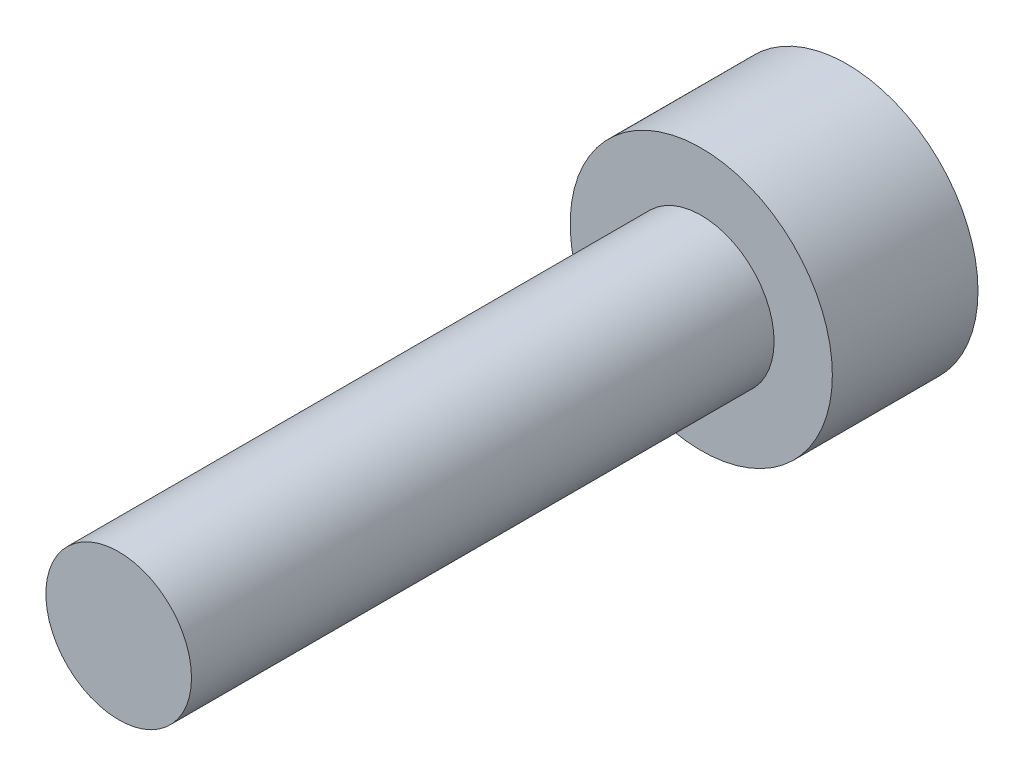
ISO-10303-21;
HEADER;
FILE_DESCRIPTION(('STEP AP214'),'2;1');
FILE_NAME('part.step','',(''),(''),'','','');
FILE_SCHEMA(('AUTOMOTIVE_DESIGN { 1 0 10303 214 1 1 1 1 }'));
ENDSEC;
DATA;
#1=APPLICATION_CONTEXT('core data for automotive mechanical design processes');
#2=APPLICATION_PROTOCOL_DEFINITION('international standard','automotive_design',2000,#1);
#3=PRODUCT_CONTEXT('',#1,'mechanical');
#4=PRODUCT('Part','Part','',(#3));
#5=PRODUCT_RELATED_PRODUCT_CATEGORY('part','',(#4));
#6=PRODUCT_DEFINITION_FORMATION('','',#4);
#7=PRODUCT_DEFINITION_CONTEXT('part definition',#1,'design');
#8=PRODUCT_DEFINITION('design','',#6,#7);
#9=PRODUCT_DEFINITION_SHAPE('','',#8);
#10=(LENGTH_UNIT() NAMED_UNIT(*) SI_UNIT(.MILLI.,.METRE.));
#11=(NAMED_UNIT(*) PLANE_ANGLE_UNIT() SI_UNIT($,.RADIAN.));
#12=(NAMED_UNIT(*) SI_UNIT($,.STERADIAN.) SOLID_ANGLE_UNIT());
#13=UNCERTAINTY_MEASURE_WITH_UNIT(LENGTH_MEASURE(1.E-05),#10,'distance_accuracy_value','');
#14=(GEOMETRIC_REPRESENTATION_CONTEXT(3) GLOBAL_UNCERTAINTY_ASSIGNED_CONTEXT((#13)) GLOBAL_UNIT_ASSIGNED_CONTEXT((#10,
#11,#12)) REPRESENTATION_CONTEXT('',''));
#15=CARTESIAN_POINT('',(0.,0.,0.));
#16=DIRECTION('',(0.,0.,1.));
#17=DIRECTION('',(1.,0.,0.));
#18=AXIS2_PLACEMENT_3D('',#15,#16,#17);
#19=CARTESIAN_POINT('',(0.,0.,2.5));
#20=DIRECTION('',(0.,0.,-1.));
#21=DIRECTION('',(-1.,0.,0.));
#22=AXIS2_PLACEMENT_3D('',#19,#20,#21);
#23=CYLINDRICAL_SURFACE('',#22,2.25);
#24=CARTESIAN_POINT('',(0.,0.,2.5));
#25=DIRECTION('',(0.,0.,1.));
#26=DIRECTION('',(1.,0.,0.));
#27=AXIS2_PLACEMENT_3D('',#24,#25,#26);
#28=CIRCLE('',#27,2.25);
#29=CARTESIAN_POINT('',(2.25,0.,2.5));
#30=VERTEX_POINT('',#29);
#31=EDGE_CURVE('E11',#30,#30,#28,.T.);
#32=ORIENTED_EDGE('',*,*,#31,.F.);
#33=EDGE_LOOP('',(#32));
#34=FACE_BOUND('',#33,.T.);
#35=CARTESIAN_POINT('',(0.,0.,0.));
#36=DIRECTION('',(0.,0.,1.));
#37=DIRECTION('',(1.,0.,0.));
#38=AXIS2_PLACEMENT_3D('',#35,#36,#37);
#39=CIRCLE('',#38,2.25);
#40=CARTESIAN_POINT('',(2.25,0.,0.));
#41=VERTEX_POINT('',#40);
#42=EDGE_CURVE('E40',#41,#41,#39,.T.);
#43=ORIENTED_EDGE('',*,*,#42,.T.);
#44=EDGE_LOOP('',(#43));
#45=FACE_BOUND('',#44,.T.);
#46=ADVANCED_FACE('F37',(#34,#45),#23,.T.);
#47=CARTESIAN_POINT('',(0.,0.,2.5));
#48=DIRECTION('',(0.,0.,1.));
#49=DIRECTION('',(1.,0.,0.));
#50=AXIS2_PLACEMENT_3D('',#47,#48,#49);
#51=PLANE('',#50);
#52=CARTESIAN_POINT('',(0.,0.,2.5));
#53=DIRECTION('',(0.,0.,1.));
#54=DIRECTION('',(1.,0.,0.));
#55=AXIS2_PLACEMENT_3D('',#52,#53,#54);
#56=CIRCLE('',#55,1.25);
#57=CARTESIAN_POINT('',(1.25,0.,2.5));
#58=VERTEX_POINT('',#57);
#59=EDGE_CURVE('E138',#58,#58,#56,.T.);
#60=ORIENTED_EDGE('',*,*,#59,.F.);
#61=EDGE_LOOP('',(#60));
#62=FACE_BOUND('',#61,.T.);
#63=ORIENTED_EDGE('',*,*,#31,.T.);
#64=EDGE_LOOP('',(#63));
#65=FACE_BOUND('',#64,.T.);
#66=ADVANCED_FACE('F152',(#62,#65),#51,.T.);
#67=CARTESIAN_POINT('',(0.,0.,0.));
#68=DIRECTION('',(0.,0.,1.));
#69=DIRECTION('',(1.,0.,0.));
#70=AXIS2_PLACEMENT_3D('',#67,#68,#69);
#71=PLANE('',#70);
#72=DIRECTION('',(0.5,0.866025403784438,0.));
#73=VECTOR('',#72,1.);
#74=CARTESIAN_POINT('',(-1.15470053837925,0.,0.));
#75=LINE('',#74,#73);
#76=CARTESIAN_POINT('',(-1.15470053837925,0.,0.));
#77=VERTEX_POINT('',#76);
#78=CARTESIAN_POINT('',(-0.577350269189626,1.,0.));
#79=VERTEX_POINT('',#78);
#80=EDGE_CURVE('E125',#77,#79,#75,.T.);
#81=ORIENTED_EDGE('',*,*,#80,.F.);
#82=DIRECTION('',(-0.5,0.866025403784439,0.));
#83=VECTOR('',#82,1.);
#84=CARTESIAN_POINT('',(-0.577350269189626,-1.,0.));
#85=LINE('',#84,#83);
#86=CARTESIAN_POINT('',(-0.577350269189626,-1.,0.));
#87=VERTEX_POINT('',#86);
#88=EDGE_CURVE('E51',#87,#77,#85,.T.);
#89=ORIENTED_EDGE('',*,*,#88,.F.);
#90=DIRECTION('',(-1.,0.,0.));
#91=VECTOR('',#90,1.);
#92=CARTESIAN_POINT('',(0.577350269189626,-1.,0.));
#93=LINE('',#92,#91);
#94=CARTESIAN_POINT('',(0.577350269189626,-1.,0.));
#95=VERTEX_POINT('',#94);
#96=EDGE_CURVE('E134',#95,#87,#93,.T.);
#97=ORIENTED_EDGE('',*,*,#96,.F.);
#98=DIRECTION('',(-0.5,-0.866025403784438,0.));
#99=VECTOR('',#98,1.);
#100=CARTESIAN_POINT('',(1.15470053837925,0.,0.));
#101=LINE('',#100,#99);
#102=CARTESIAN_POINT('',(1.15470053837925,0.,0.));
#103=VERTEX_POINT('',#102);
#104=EDGE_CURVE('E132',#103,#95,#101,.T.);
#105=ORIENTED_EDGE('',*,*,#104,.F.);
#106=DIRECTION('',(0.5,-0.866025403784439,0.));
#107=VECTOR('',#106,1.);
#108=CARTESIAN_POINT('',(0.577350269189626,1.,0.));
#109=LINE('',#108,#107);
#110=CARTESIAN_POINT('',(0.577350269189626,1.,0.));
#111=VERTEX_POINT('',#110);
#112=EDGE_CURVE('E99',#111,#103,#109,.T.);
#113=ORIENTED_EDGE('',*,*,#112,.F.);
#114=DIRECTION('',(1.,0.,0.));
#115=VECTOR('',#114,1.);
#116=CARTESIAN_POINT('',(-0.577350269189626,1.,0.));
#117=LINE('',#116,#115);
#118=EDGE_CURVE('E128',#79,#111,#117,.T.);
#119=ORIENTED_EDGE('',*,*,#118,.F.);
#120=EDGE_LOOP('',(#81,#89,#97,#105,#113,#119));
#121=FACE_BOUND('',#120,.T.);
#122=ORIENTED_EDGE('',*,*,#42,.F.);
#123=EDGE_LOOP('',(#122));
#124=FACE_BOUND('',#123,.T.);
#125=ADVANCED_FACE('F155',(#121,#124),#71,.F.);
#126=CARTESIAN_POINT('',(0.,0.,12.5));
#127=DIRECTION('',(0.,0.,-1.));
#128=DIRECTION('',(-1.,0.,0.));
#129=AXIS2_PLACEMENT_3D('',#126,#127,#128);
#130=CYLINDRICAL_SURFACE('',#129,1.25);
#131=CARTESIAN_POINT('',(0.,0.,12.5));
#132=DIRECTION('',(0.,0.,1.));
#133=DIRECTION('',(1.,0.,0.));
#134=AXIS2_PLACEMENT_3D('',#131,#132,#133);
#135=CIRCLE('',#134,1.25);
#136=CARTESIAN_POINT('',(1.25,0.,12.5));
#137=VERTEX_POINT('',#136);
#138=EDGE_CURVE('E144',#137,#137,#135,.T.);
#139=ORIENTED_EDGE('',*,*,#138,.F.);
#140=EDGE_LOOP('',(#139));
#141=FACE_BOUND('',#140,.T.);
#142=ORIENTED_EDGE('',*,*,#59,.T.);
#143=EDGE_LOOP('',(#142));
#144=FACE_BOUND('',#143,.T.);
#145=ADVANCED_FACE('F150',(#141,#144),#130,.T.);
#146=CARTESIAN_POINT('',(0.,0.,12.5));
#147=DIRECTION('',(0.,0.,1.));
#148=DIRECTION('',(1.,0.,0.));
#149=AXIS2_PLACEMENT_3D('',#146,#147,#148);
#150=PLANE('',#149);
#151=ORIENTED_EDGE('',*,*,#138,.T.);
#152=EDGE_LOOP('',(#151));
#153=FACE_BOUND('',#152,.T.);
#154=ADVANCED_FACE('F169',(#153),#150,.T.);
#155=CARTESIAN_POINT('',(-0.577350269189626,-1.,1.));
#156=DIRECTION('',(-0.866025403784439,-0.5,0.));
#157=DIRECTION('',(0.5,-0.866025403784439,0.));
#158=AXIS2_PLACEMENT_3D('',#155,#156,#157);
#159=PLANE('',#158);
#160=ORIENTED_EDGE('',*,*,#88,.T.);
#161=DIRECTION('',(0.,0.,-1.));
#162=VECTOR('',#161,1.);
#163=CARTESIAN_POINT('',(-1.15470053837925,0.,1.));
#164=LINE('',#163,#162);
#165=CARTESIAN_POINT('',(-1.15470053837925,0.,1.));
#166=VERTEX_POINT('',#165);
#167=EDGE_CURVE('E81',#166,#77,#164,.T.);
#168=ORIENTED_EDGE('',*,*,#167,.F.);
#169=DIRECTION('',(-0.5,0.866025403784439,0.));
#170=VECTOR('',#169,1.);
#171=CARTESIAN_POINT('',(-0.577350269189626,-1.,1.));
#172=LINE('',#171,#170);
#173=CARTESIAN_POINT('',(-0.577350269189626,-1.,1.));
#174=VERTEX_POINT('',#173);
#175=EDGE_CURVE('E136',#174,#166,#172,.T.);
#176=ORIENTED_EDGE('',*,*,#175,.F.);
#177=DIRECTION('',(0.,0.,-1.));
#178=VECTOR('',#177,1.);
#179=CARTESIAN_POINT('',(-0.577350269189626,-1.,1.));
#180=LINE('',#179,#178);
#181=EDGE_CURVE('E59',#174,#87,#180,.T.);
#182=ORIENTED_EDGE('',*,*,#181,.T.);
#183=EDGE_LOOP('',(#160,#168,#176,#182));
#184=FACE_BOUND('',#183,.T.);
#185=ADVANCED_FACE('F176',(#184),#159,.F.);
#186=CARTESIAN_POINT('',(0.577350269189626,-1.,1.));
#187=DIRECTION('',(0.,-1.,0.));
#188=DIRECTION('',(0.,0.,-1.));
#189=AXIS2_PLACEMENT_3D('',#186,#187,#188);
#190=PLANE('',#189);
#191=ORIENTED_EDGE('',*,*,#96,.T.);
#192=ORIENTED_EDGE('',*,*,#181,.F.);
#193=DIRECTION('',(-1.,0.,0.));
#194=VECTOR('',#193,1.);
#195=CARTESIAN_POINT('',(0.577350269189626,-1.,1.));
#196=LINE('',#195,#194);
#197=CARTESIAN_POINT('',(0.577350269189626,-1.,1.));
#198=VERTEX_POINT('',#197);
#199=EDGE_CURVE('E111',#198,#174,#196,.T.);
#200=ORIENTED_EDGE('',*,*,#199,.F.);
#201=DIRECTION('',(0.,0.,-1.));
#202=VECTOR('',#201,1.);
#203=CARTESIAN_POINT('',(0.577350269189626,-1.,1.));
#204=LINE('',#203,#202);
#205=EDGE_CURVE('E103',#198,#95,#204,.T.);
#206=ORIENTED_EDGE('',*,*,#205,.T.);
#207=EDGE_LOOP('',(#191,#192,#200,#206));
#208=FACE_BOUND('',#207,.T.);
#209=ADVANCED_FACE('F180',(#208),#190,.F.);
#210=CARTESIAN_POINT('',(1.15470053837925,0.,1.));
#211=DIRECTION('',(0.866025403784439,-0.5,0.));
#212=DIRECTION('',(0.5,0.866025403784439,0.));
#213=AXIS2_PLACEMENT_3D('',#210,#211,#212);
#214=PLANE('',#213);
#215=ORIENTED_EDGE('',*,*,#104,.T.);
#216=ORIENTED_EDGE('',*,*,#205,.F.);
#217=DIRECTION('',(-0.5,-0.866025403784438,0.));
#218=VECTOR('',#217,1.);
#219=CARTESIAN_POINT('',(1.15470053837925,0.,1.));
#220=LINE('',#219,#218);
#221=CARTESIAN_POINT('',(1.15470053837925,0.,1.));
#222=VERTEX_POINT('',#221);
#223=EDGE_CURVE('E107',#222,#198,#220,.T.);
#224=ORIENTED_EDGE('',*,*,#223,.F.);
#225=DIRECTION('',(0.,0.,-1.));
#226=VECTOR('',#225,1.);
#227=CARTESIAN_POINT('',(1.15470053837925,0.,1.));
#228=LINE('',#227,#226);
#229=EDGE_CURVE('E92',#222,#103,#228,.T.);
#230=ORIENTED_EDGE('',*,*,#229,.T.);
#231=EDGE_LOOP('',(#215,#216,#224,#230));
#232=FACE_BOUND('',#231,.T.);
#233=ADVANCED_FACE('F108',(#232),#214,.F.);
#234=CARTESIAN_POINT('',(0.577350269189626,1.,1.));
#235=DIRECTION('',(0.866025403784439,0.5,0.));
#236=DIRECTION('',(-0.5,0.866025403784439,0.));
#237=AXIS2_PLACEMENT_3D('',#234,#235,#236);
#238=PLANE('',#237);
#239=ORIENTED_EDGE('',*,*,#112,.T.);
#240=ORIENTED_EDGE('',*,*,#229,.F.);
#241=DIRECTION('',(0.5,-0.866025403784439,0.));
#242=VECTOR('',#241,1.);
#243=CARTESIAN_POINT('',(0.577350269189626,1.,1.));
#244=LINE('',#243,#242);
#245=CARTESIAN_POINT('',(0.577350269189626,1.,1.));
#246=VERTEX_POINT('',#245);
#247=EDGE_CURVE('E96',#246,#222,#244,.T.);
#248=ORIENTED_EDGE('',*,*,#247,.F.);
#249=DIRECTION('',(0.,0.,-1.));
#250=VECTOR('',#249,1.);
#251=CARTESIAN_POINT('',(0.577350269189626,1.,1.));
#252=LINE('',#251,#250);
#253=EDGE_CURVE('E104',#246,#111,#252,.T.);
#254=ORIENTED_EDGE('',*,*,#253,.T.);
#255=EDGE_LOOP('',(#239,#240,#248,#254));
#256=FACE_BOUND('',#255,.T.);
#257=ADVANCED_FACE('F94',(#256),#238,.F.);
#258=CARTESIAN_POINT('',(-0.577350269189626,1.,1.));
#259=DIRECTION('',(0.,1.,0.));
#260=DIRECTION('',(0.,0.,1.));
#261=AXIS2_PLACEMENT_3D('',#258,#259,#260);
#262=PLANE('',#261);
#263=ORIENTED_EDGE('',*,*,#118,.T.);
#264=ORIENTED_EDGE('',*,*,#253,.F.);
#265=DIRECTION('',(1.,0.,0.));
#266=VECTOR('',#265,1.);
#267=CARTESIAN_POINT('',(-0.577350269189626,1.,1.));
#268=LINE('',#267,#266);
#269=CARTESIAN_POINT('',(-0.577350269189626,1.,1.));
#270=VERTEX_POINT('',#269);
#271=EDGE_CURVE('E117',#270,#246,#268,.T.);
#272=ORIENTED_EDGE('',*,*,#271,.F.);
#273=DIRECTION('',(0.,0.,-1.));
#274=VECTOR('',#273,1.);
#275=CARTESIAN_POINT('',(-0.577350269189626,1.,1.));
#276=LINE('',#275,#274);
#277=EDGE_CURVE('E141',#270,#79,#276,.T.);
#278=ORIENTED_EDGE('',*,*,#277,.T.);
#279=EDGE_LOOP('',(#263,#264,#272,#278));
#280=FACE_BOUND('',#279,.T.);
#281=ADVANCED_FACE('F184',(#280),#262,.F.);
#282=CARTESIAN_POINT('',(-1.15470053837925,0.,1.));
#283=DIRECTION('',(-0.866025403784438,0.5,0.));
#284=DIRECTION('',(-0.5,-0.866025403784439,0.));
#285=AXIS2_PLACEMENT_3D('',#282,#283,#284);
#286=PLANE('',#285);
#287=ORIENTED_EDGE('',*,*,#80,.T.);
#288=ORIENTED_EDGE('',*,*,#277,.F.);
#289=DIRECTION('',(0.5,0.866025403784438,0.));
#290=VECTOR('',#289,1.);
#291=CARTESIAN_POINT('',(-1.15470053837925,0.,1.));
#292=LINE('',#291,#290);
#293=EDGE_CURVE('E119',#166,#270,#292,.T.);
#294=ORIENTED_EDGE('',*,*,#293,.F.);
#295=ORIENTED_EDGE('',*,*,#167,.T.);
#296=EDGE_LOOP('',(#287,#288,#294,#295));
#297=FACE_BOUND('',#296,.T.);
#298=ADVANCED_FACE('F181',(#297),#286,.F.);
#299=CARTESIAN_POINT('',(0.,0.,1.));
#300=DIRECTION('',(0.,0.,-1.));
#301=DIRECTION('',(-1.,0.,0.));
#302=AXIS2_PLACEMENT_3D('',#299,#300,#301);
#303=PLANE('',#302);
#304=ORIENTED_EDGE('',*,*,#175,.T.);
#305=ORIENTED_EDGE('',*,*,#293,.T.);
#306=ORIENTED_EDGE('',*,*,#271,.T.);
#307=ORIENTED_EDGE('',*,*,#247,.T.);
#308=ORIENTED_EDGE('',*,*,#223,.T.);
#309=ORIENTED_EDGE('',*,*,#199,.T.);
#310=EDGE_LOOP('',(#304,#305,#306,#307,#308,#309));
#311=FACE_BOUND('',#310,.T.);
#312=ADVANCED_FACE('F114',(#311),#303,.T.);
#313=CLOSED_SHELL('',(#46,#66,#125,#145,#154,#185,#209,#233,#257,#281,#298,#312));
#314=MANIFOLD_SOLID_BREP('B2',#313);
#315=ADVANCED_BREP_SHAPE_REPRESENTATION('',(#18,#314),#14);
#316=SHAPE_DEFINITION_REPRESENTATION(#9,#315);
ENDSEC;
END-ISO-10303-21;
